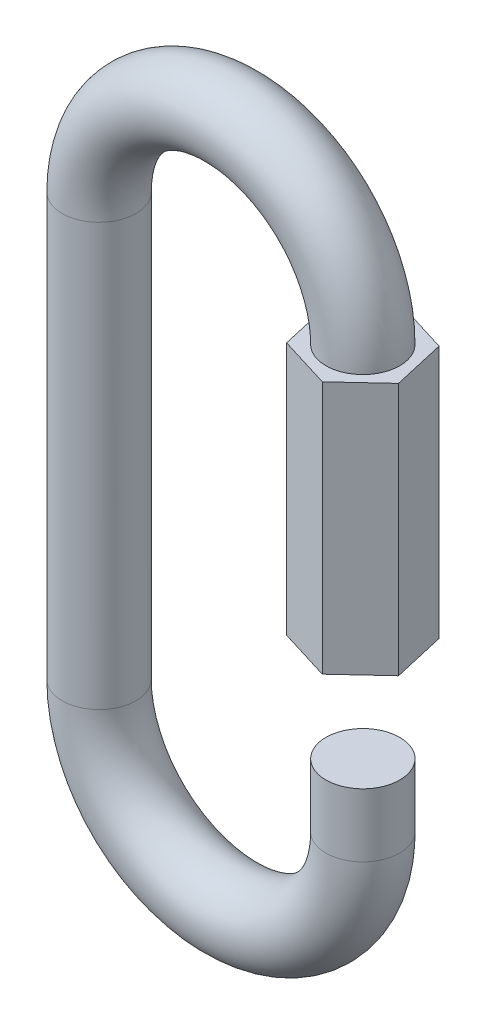
ISO-10303-21;
HEADER;
FILE_DESCRIPTION(('STEP AP214'),'2;1');
FILE_NAME('part.step','',(''),(''),'','','');
FILE_SCHEMA(('AUTOMOTIVE_DESIGN { 1 0 10303 214 1 1 1 1 }'));
ENDSEC;
DATA;
#1=APPLICATION_CONTEXT('core data for automotive mechanical design processes');
#2=APPLICATION_PROTOCOL_DEFINITION('international standard','automotive_design',2000,#1);
#3=PRODUCT_CONTEXT('',#1,'mechanical');
#4=PRODUCT('Part','Part','',(#3));
#5=PRODUCT_RELATED_PRODUCT_CATEGORY('part','',(#4));
#6=PRODUCT_DEFINITION_FORMATION('','',#4);
#7=PRODUCT_DEFINITION_CONTEXT('part definition',#1,'design');
#8=PRODUCT_DEFINITION('design','',#6,#7);
#9=PRODUCT_DEFINITION_SHAPE('','',#8);
#10=(LENGTH_UNIT() NAMED_UNIT(*) SI_UNIT(.MILLI.,.METRE.));
#11=(NAMED_UNIT(*) PLANE_ANGLE_UNIT() SI_UNIT($,.RADIAN.));
#12=(NAMED_UNIT(*) SI_UNIT($,.STERADIAN.) SOLID_ANGLE_UNIT());
#13=UNCERTAINTY_MEASURE_WITH_UNIT(LENGTH_MEASURE(1.E-05),#10,'distance_accuracy_value','');
#14=(GEOMETRIC_REPRESENTATION_CONTEXT(3) GLOBAL_UNCERTAINTY_ASSIGNED_CONTEXT((#13)) GLOBAL_UNIT_ASSIGNED_CONTEXT((#10,
#11,#12)) REPRESENTATION_CONTEXT('',''));
#15=CARTESIAN_POINT('',(0.,0.,0.));
#16=DIRECTION('',(0.,0.,1.));
#17=DIRECTION('',(1.,0.,0.));
#18=AXIS2_PLACEMENT_3D('',#15,#16,#17);
#19=CARTESIAN_POINT('',(0.,-9.99999999999999,0.));
#20=DIRECTION('',(0.,1.,0.));
#21=DIRECTION('',(0.,0.,1.));
#22=AXIS2_PLACEMENT_3D('',#19,#20,#21);
#23=PLANE('',#22);
#24=CARTESIAN_POINT('',(0.,-9.99999999999999,0.));
#25=DIRECTION('',(0.,1.,0.));
#26=DIRECTION('',(0.,0.,1.));
#27=AXIS2_PLACEMENT_3D('',#24,#25,#26);
#28=CIRCLE('',#27,3.5);
#29=CARTESIAN_POINT('',(0.,-9.99999999999999,3.5));
#30=VERTEX_POINT('',#29);
#31=EDGE_CURVE('E41',#30,#30,#28,.T.);
#32=ORIENTED_EDGE('',*,*,#31,.T.);
#33=EDGE_LOOP('',(#32));
#34=FACE_BOUND('',#33,.T.);
#35=ADVANCED_FACE('F38',(#34),#23,.T.);
#36=CARTESIAN_POINT('',(0.,-15.9999999987516,0.));
#37=DIRECTION('',(0.,1.,0.));
#38=DIRECTION('',(-1.,0.,0.));
#39=AXIS2_PLACEMENT_3D('',#36,#37,#38);
#40=CYLINDRICAL_SURFACE('',#39,3.5);
#41=ORIENTED_EDGE('',*,*,#31,.F.);
#42=EDGE_LOOP('',(#41));
#43=FACE_BOUND('',#42,.T.);
#44=CARTESIAN_POINT('',(0.,-15.9999999987516,0.));
#45=DIRECTION('',(-9.9724466626891E-11,1.,0.));
#46=DIRECTION('',(0.,0.,1.));
#47=AXIS2_PLACEMENT_3D('',#44,#45,#46);
#48=CIRCLE('',#47,3.5);
#49=CARTESIAN_POINT('',(0.,-15.9999999987516,3.5));
#50=VERTEX_POINT('',#49);
#51=EDGE_CURVE('E153',#50,#50,#48,.T.);
#52=ORIENTED_EDGE('',*,*,#51,.T.);
#53=EDGE_LOOP('',(#52));
#54=FACE_BOUND('',#53,.T.);
#55=ADVANCED_FACE('F161',(#43,#54),#40,.T.);
#56=CARTESIAN_POINT('',(-12.5000000000031,-15.9999999999981,0.));
#57=DIRECTION('',(0.,0.,1.));
#58=DIRECTION('',(1.,0.,0.));
#59=AXIS2_PLACEMENT_3D('',#56,#57,#58);
#60=TOROIDAL_SURFACE('',#59,12.5000000000031,3.5);
#61=ORIENTED_EDGE('',*,*,#51,.F.);
#62=EDGE_LOOP('',(#61));
#63=FACE_BOUND('',#62,.T.);
#64=CARTESIAN_POINT('',(-25.,-16.0000124867645,0.));
#65=DIRECTION('',(0.,-1.,0.));
#66=DIRECTION('',(0.,0.,1.));
#67=AXIS2_PLACEMENT_3D('',#64,#65,#66);
#68=CIRCLE('',#67,3.5);
#69=CARTESIAN_POINT('',(-25.,-16.0000124867645,3.5));
#70=VERTEX_POINT('',#69);
#71=EDGE_CURVE('E11',#70,#70,#68,.T.);
#72=ORIENTED_EDGE('',*,*,#71,.T.);
#73=EDGE_LOOP('',(#72));
#74=FACE_BOUND('',#73,.T.);
#75=ADVANCED_FACE('F163',(#63,#74),#60,.T.);
#76=CARTESIAN_POINT('',(-12.5,24.,0.));
#77=DIRECTION('',(0.,0.,1.));
#78=DIRECTION('',(1.,0.,0.));
#79=AXIS2_PLACEMENT_3D('',#76,#77,#78);
#80=TOROIDAL_SURFACE('',#79,12.5,3.5);
#81=CARTESIAN_POINT('',(0.,24.,0.));
#82=DIRECTION('',(0.,-1.,0.));
#83=DIRECTION('',(0.,0.,-1.));
#84=AXIS2_PLACEMENT_3D('',#81,#82,#83);
#85=CIRCLE('',#84,3.5);
#86=CARTESIAN_POINT('',(3.49999999999999,24.,0.));
#87=VERTEX_POINT('',#86);
#88=EDGE_CURVE('E144',#87,#87,#85,.F.);
#89=CARTESIAN_POINT('',(-25.,24.,0.));
#90=DIRECTION('',(0.,-1.,0.));
#91=DIRECTION('',(0.,0.,1.));
#92=AXIS2_PLACEMENT_3D('',#89,#90,#91);
#93=CIRCLE('',#92,3.5);
#94=CARTESIAN_POINT('',(-28.5,24.,0.));
#95=VERTEX_POINT('',#94);
#96=EDGE_CURVE('E47',#95,#95,#93,.T.);
#97=CARTESIAN_POINT('',(-12.5,24.,0.));
#98=DIRECTION('',(0.,0.,1.));
#99=DIRECTION('',(1.,0.,0.));
#100=AXIS2_PLACEMENT_3D('',#97,#98,#99);
#101=CIRCLE('',#100,16.);
#102=EDGE_CURVE('',#87,#95,#101,.T.);
#103=ORIENTED_EDGE('',*,*,#88,.T.);
#104=ORIENTED_EDGE('',*,*,#96,.F.);
#105=ORIENTED_EDGE('',*,*,#102,.T.);
#106=ORIENTED_EDGE('',*,*,#102,.F.);
#107=EDGE_LOOP('',(#103,#105,#104,#106));
#108=FACE_BOUND('',#107,.T.);
#109=ADVANCED_FACE('F169',(#108),#80,.T.);
#110=CARTESIAN_POINT('',(-25.,24.,0.));
#111=DIRECTION('',(0.,-1.,0.));
#112=DIRECTION('',(0.,0.,-1.));
#113=AXIS2_PLACEMENT_3D('',#110,#111,#112);
#114=CYLINDRICAL_SURFACE('',#113,3.5);
#115=ORIENTED_EDGE('',*,*,#71,.F.);
#116=EDGE_LOOP('',(#115));
#117=FACE_BOUND('',#116,.T.);
#118=ORIENTED_EDGE('',*,*,#96,.T.);
#119=EDGE_LOOP('',(#118));
#120=FACE_BOUND('',#119,.T.);
#121=ADVANCED_FACE('F173',(#117,#120),#114,.T.);
#122=CARTESIAN_POINT('',(3.74656550790719,24.,-3.48075926511388));
#123=DIRECTION('',(0.974785628522451,0.,-0.223143403277108));
#124=DIRECTION('',(-0.223143403277108,0.,-0.974785628522451));
#125=AXIS2_PLACEMENT_3D('',#122,#123,#124);
#126=PLANE('',#125);
#127=DIRECTION('',(0.223143403277108,0.,0.974785628522451));
#128=VECTOR('',#127,1.);
#129=CARTESIAN_POINT('',(3.74656550790719,0.,-3.48075926511388));
#130=LINE('',#129,#128);
#131=CARTESIAN_POINT('',(3.74656550790719,0.,-3.48075926511388));
#132=VERTEX_POINT('',#131);
#133=CARTESIAN_POINT('',(4.88770870200027,0.,1.50424127423324));
#134=VERTEX_POINT('',#133);
#135=EDGE_CURVE('E127',#132,#134,#130,.T.);
#136=ORIENTED_EDGE('',*,*,#135,.F.);
#137=DIRECTION('',(0.,-1.,0.));
#138=VECTOR('',#137,1.);
#139=CARTESIAN_POINT('',(3.74656550790719,24.,-3.48075926511388));
#140=LINE('',#139,#138);
#141=CARTESIAN_POINT('',(3.74656550790719,24.,-3.48075926511388));
#142=VERTEX_POINT('',#141);
#143=EDGE_CURVE('E56',#142,#132,#140,.T.);
#144=ORIENTED_EDGE('',*,*,#143,.F.);
#145=DIRECTION('',(0.223143403277108,0.,0.974785628522451));
#146=VECTOR('',#145,1.);
#147=CARTESIAN_POINT('',(3.74656550790719,24.,-3.48075926511388));
#148=LINE('',#147,#146);
#149=CARTESIAN_POINT('',(4.88770870200027,24.,1.50424127423324));
#150=VERTEX_POINT('',#149);
#151=EDGE_CURVE('E142',#142,#150,#148,.T.);
#152=ORIENTED_EDGE('',*,*,#151,.T.);
#153=DIRECTION('',(0.,-1.,0.));
#154=VECTOR('',#153,1.);
#155=CARTESIAN_POINT('',(4.88770870200027,24.,1.50424127423324));
#156=LINE('',#155,#154);
#157=EDGE_CURVE('E91',#150,#134,#156,.T.);
#158=ORIENTED_EDGE('',*,*,#157,.T.);
#159=EDGE_LOOP('',(#136,#144,#152,#158));
#160=FACE_BOUND('',#159,.T.);
#161=ADVANCED_FACE('F172',(#160),#126,.T.);
#162=CARTESIAN_POINT('',(-1.14114319409308,24.,-4.98500053934712));
#163=DIRECTION('',(0.294144958336334,0.,-0.955760819182978));
#164=DIRECTION('',(-0.955760819182978,0.,-0.294144958336334));
#165=AXIS2_PLACEMENT_3D('',#162,#163,#164);
#166=PLANE('',#165);
#167=DIRECTION('',(0.955760819182978,0.,0.294144958336334));
#168=VECTOR('',#167,1.);
#169=CARTESIAN_POINT('',(-1.14114319409308,0.,-4.98500053934712));
#170=LINE('',#169,#168);
#171=CARTESIAN_POINT('',(-1.14114319409308,0.,-4.98500053934712));
#172=VERTEX_POINT('',#171);
#173=EDGE_CURVE('E139',#172,#132,#170,.T.);
#174=ORIENTED_EDGE('',*,*,#173,.F.);
#175=DIRECTION('',(0.,-1.,0.));
#176=VECTOR('',#175,1.);
#177=CARTESIAN_POINT('',(-1.14114319409308,24.,-4.98500053934712));
#178=LINE('',#177,#176);
#179=CARTESIAN_POINT('',(-1.14114319409308,24.,-4.98500053934712));
#180=VERTEX_POINT('',#179);
#181=EDGE_CURVE('E79',#180,#172,#178,.T.);
#182=ORIENTED_EDGE('',*,*,#181,.F.);
#183=DIRECTION('',(0.955760819182978,0.,0.294144958336334));
#184=VECTOR('',#183,1.);
#185=CARTESIAN_POINT('',(-1.14114319409308,24.,-4.98500053934712));
#186=LINE('',#185,#184);
#187=EDGE_CURVE('E117',#180,#142,#186,.T.);
#188=ORIENTED_EDGE('',*,*,#187,.T.);
#189=ORIENTED_EDGE('',*,*,#143,.T.);
#190=EDGE_LOOP('',(#174,#182,#188,#189));
#191=FACE_BOUND('',#190,.T.);
#192=ADVANCED_FACE('F181',(#191),#166,.T.);
#193=CARTESIAN_POINT('',(-4.88770870200027,24.,-1.50424127423324));
#194=DIRECTION('',(-0.680640670186117,0.,-0.732617415905869));
#195=DIRECTION('',(-0.732617415905869,0.,0.680640670186117));
#196=AXIS2_PLACEMENT_3D('',#193,#194,#195);
#197=PLANE('',#196);
#198=DIRECTION('',(0.732617415905869,0.,-0.680640670186117));
#199=VECTOR('',#198,1.);
#200=CARTESIAN_POINT('',(-4.88770870200027,0.,-1.50424127423324));
#201=LINE('',#200,#199);
#202=CARTESIAN_POINT('',(-4.88770870200027,0.,-1.50424127423324));
#203=VERTEX_POINT('',#202);
#204=EDGE_CURVE('E104',#203,#172,#201,.T.);
#205=ORIENTED_EDGE('',*,*,#204,.F.);
#206=DIRECTION('',(0.,-1.,0.));
#207=VECTOR('',#206,1.);
#208=CARTESIAN_POINT('',(-4.88770870200027,24.,-1.50424127423324));
#209=LINE('',#208,#207);
#210=CARTESIAN_POINT('',(-4.88770870200027,24.,-1.50424127423324));
#211=VERTEX_POINT('',#210);
#212=EDGE_CURVE('E99',#211,#203,#209,.T.);
#213=ORIENTED_EDGE('',*,*,#212,.F.);
#214=DIRECTION('',(0.732617415905869,0.,-0.680640670186117));
#215=VECTOR('',#214,1.);
#216=CARTESIAN_POINT('',(-4.88770870200027,24.,-1.50424127423324));
#217=LINE('',#216,#215);
#218=EDGE_CURVE('E102',#211,#180,#217,.T.);
#219=ORIENTED_EDGE('',*,*,#218,.T.);
#220=ORIENTED_EDGE('',*,*,#181,.T.);
#221=EDGE_LOOP('',(#205,#213,#219,#220));
#222=FACE_BOUND('',#221,.T.);
#223=ADVANCED_FACE('F101',(#222),#197,.T.);
#224=CARTESIAN_POINT('',(-3.74656550790719,24.,3.48075926511388));
#225=DIRECTION('',(-0.974785628522451,0.,0.223143403277109));
#226=DIRECTION('',(0.223143403277109,0.,0.974785628522451));
#227=AXIS2_PLACEMENT_3D('',#224,#225,#226);
#228=PLANE('',#227);
#229=DIRECTION('',(-0.223143403277109,0.,-0.974785628522451));
#230=VECTOR('',#229,1.);
#231=CARTESIAN_POINT('',(-3.74656550790719,0.,3.48075926511388));
#232=LINE('',#231,#230);
#233=CARTESIAN_POINT('',(-3.74656550790719,0.,3.48075926511388));
#234=VERTEX_POINT('',#233);
#235=EDGE_CURVE('E136',#234,#203,#232,.T.);
#236=ORIENTED_EDGE('',*,*,#235,.F.);
#237=DIRECTION('',(0.,-1.,0.));
#238=VECTOR('',#237,1.);
#239=CARTESIAN_POINT('',(-3.74656550790719,24.,3.48075926511388));
#240=LINE('',#239,#238);
#241=CARTESIAN_POINT('',(-3.74656550790719,24.,3.48075926511388));
#242=VERTEX_POINT('',#241);
#243=EDGE_CURVE('E109',#242,#234,#240,.T.);
#244=ORIENTED_EDGE('',*,*,#243,.F.);
#245=DIRECTION('',(-0.223143403277109,0.,-0.974785628522451));
#246=VECTOR('',#245,1.);
#247=CARTESIAN_POINT('',(-3.74656550790719,24.,3.48075926511388));
#248=LINE('',#247,#246);
#249=EDGE_CURVE('E115',#242,#211,#248,.T.);
#250=ORIENTED_EDGE('',*,*,#249,.T.);
#251=ORIENTED_EDGE('',*,*,#212,.T.);
#252=EDGE_LOOP('',(#236,#244,#250,#251));
#253=FACE_BOUND('',#252,.T.);
#254=ADVANCED_FACE('F119',(#253),#228,.T.);
#255=CARTESIAN_POINT('',(1.14114319409308,24.,4.98500053934712));
#256=DIRECTION('',(-0.294144958336333,0.,0.955760819182978));
#257=DIRECTION('',(0.955760819182978,0.,0.294144958336333));
#258=AXIS2_PLACEMENT_3D('',#255,#256,#257);
#259=PLANE('',#258);
#260=DIRECTION('',(-0.955760819182978,0.,-0.294144958336333));
#261=VECTOR('',#260,1.);
#262=CARTESIAN_POINT('',(1.14114319409308,0.,4.98500053934712));
#263=LINE('',#262,#261);
#264=CARTESIAN_POINT('',(1.14114319409308,0.,4.98500053934712));
#265=VERTEX_POINT('',#264);
#266=EDGE_CURVE('E133',#265,#234,#263,.T.);
#267=ORIENTED_EDGE('',*,*,#266,.F.);
#268=DIRECTION('',(0.,-1.,0.));
#269=VECTOR('',#268,1.);
#270=CARTESIAN_POINT('',(1.14114319409308,24.,4.98500053934712));
#271=LINE('',#270,#269);
#272=CARTESIAN_POINT('',(1.14114319409308,24.,4.98500053934712));
#273=VERTEX_POINT('',#272);
#274=EDGE_CURVE('E147',#273,#265,#271,.T.);
#275=ORIENTED_EDGE('',*,*,#274,.F.);
#276=DIRECTION('',(-0.955760819182978,0.,-0.294144958336333));
#277=VECTOR('',#276,1.);
#278=CARTESIAN_POINT('',(1.14114319409308,24.,4.98500053934712));
#279=LINE('',#278,#277);
#280=EDGE_CURVE('E120',#273,#242,#279,.T.);
#281=ORIENTED_EDGE('',*,*,#280,.T.);
#282=ORIENTED_EDGE('',*,*,#243,.T.);
#283=EDGE_LOOP('',(#267,#275,#281,#282));
#284=FACE_BOUND('',#283,.T.);
#285=ADVANCED_FACE('F191',(#284),#259,.T.);
#286=CARTESIAN_POINT('',(4.88770870200027,24.,1.50424127423324));
#287=DIRECTION('',(0.680640670186117,0.,0.732617415905869));
#288=DIRECTION('',(0.732617415905869,0.,-0.680640670186117));
#289=AXIS2_PLACEMENT_3D('',#286,#287,#288);
#290=PLANE('',#289);
#291=DIRECTION('',(-0.732617415905869,0.,0.680640670186117));
#292=VECTOR('',#291,1.);
#293=CARTESIAN_POINT('',(4.88770870200027,0.,1.50424127423324));
#294=LINE('',#293,#292);
#295=EDGE_CURVE('E130',#134,#265,#294,.T.);
#296=ORIENTED_EDGE('',*,*,#295,.F.);
#297=ORIENTED_EDGE('',*,*,#157,.F.);
#298=DIRECTION('',(-0.732617415905869,0.,0.680640670186117));
#299=VECTOR('',#298,1.);
#300=CARTESIAN_POINT('',(4.88770870200027,24.,1.50424127423324));
#301=LINE('',#300,#299);
#302=EDGE_CURVE('E122',#150,#273,#301,.T.);
#303=ORIENTED_EDGE('',*,*,#302,.T.);
#304=ORIENTED_EDGE('',*,*,#274,.T.);
#305=EDGE_LOOP('',(#296,#297,#303,#304));
#306=FACE_BOUND('',#305,.T.);
#307=ADVANCED_FACE('F188',(#306),#290,.T.);
#308=CARTESIAN_POINT('',(0.,24.,0.));
#309=DIRECTION('',(0.,-1.,0.));
#310=DIRECTION('',(0.,0.,-1.));
#311=AXIS2_PLACEMENT_3D('',#308,#309,#310);
#312=PLANE('',#311);
#313=ORIENTED_EDGE('',*,*,#88,.F.);
#314=EDGE_LOOP('',(#313));
#315=FACE_BOUND('',#314,.T.);
#316=ORIENTED_EDGE('',*,*,#151,.F.);
#317=ORIENTED_EDGE('',*,*,#187,.F.);
#318=ORIENTED_EDGE('',*,*,#218,.F.);
#319=ORIENTED_EDGE('',*,*,#249,.F.);
#320=ORIENTED_EDGE('',*,*,#280,.F.);
#321=ORIENTED_EDGE('',*,*,#302,.F.);
#322=EDGE_LOOP('',(#316,#317,#318,#319,#320,#321));
#323=FACE_BOUND('',#322,.T.);
#324=ADVANCED_FACE('F113',(#315,#323),#312,.F.);
#325=CARTESIAN_POINT('',(0.,0.,0.));
#326=DIRECTION('',(0.,1.,0.));
#327=DIRECTION('',(0.,0.,1.));
#328=AXIS2_PLACEMENT_3D('',#325,#326,#327);
#329=PLANE('',#328);
#330=ORIENTED_EDGE('',*,*,#135,.T.);
#331=ORIENTED_EDGE('',*,*,#295,.T.);
#332=ORIENTED_EDGE('',*,*,#266,.T.);
#333=ORIENTED_EDGE('',*,*,#235,.T.);
#334=ORIENTED_EDGE('',*,*,#204,.T.);
#335=ORIENTED_EDGE('',*,*,#173,.T.);
#336=EDGE_LOOP('',(#330,#331,#332,#333,#334,#335));
#337=FACE_BOUND('',#336,.T.);
#338=ADVANCED_FACE('F202',(#337),#329,.F.);
#339=CLOSED_SHELL('',(#35,#55,#75,#109,#121,#161,#192,#223,#254,#285,#307,#324,#338));
#340=MANIFOLD_SOLID_BREP('B2',#339);
#341=ADVANCED_BREP_SHAPE_REPRESENTATION('',(#18,#340),#14);
#342=SHAPE_DEFINITION_REPRESENTATION(#9,#341);
ENDSEC;
END-ISO-10303-21;
